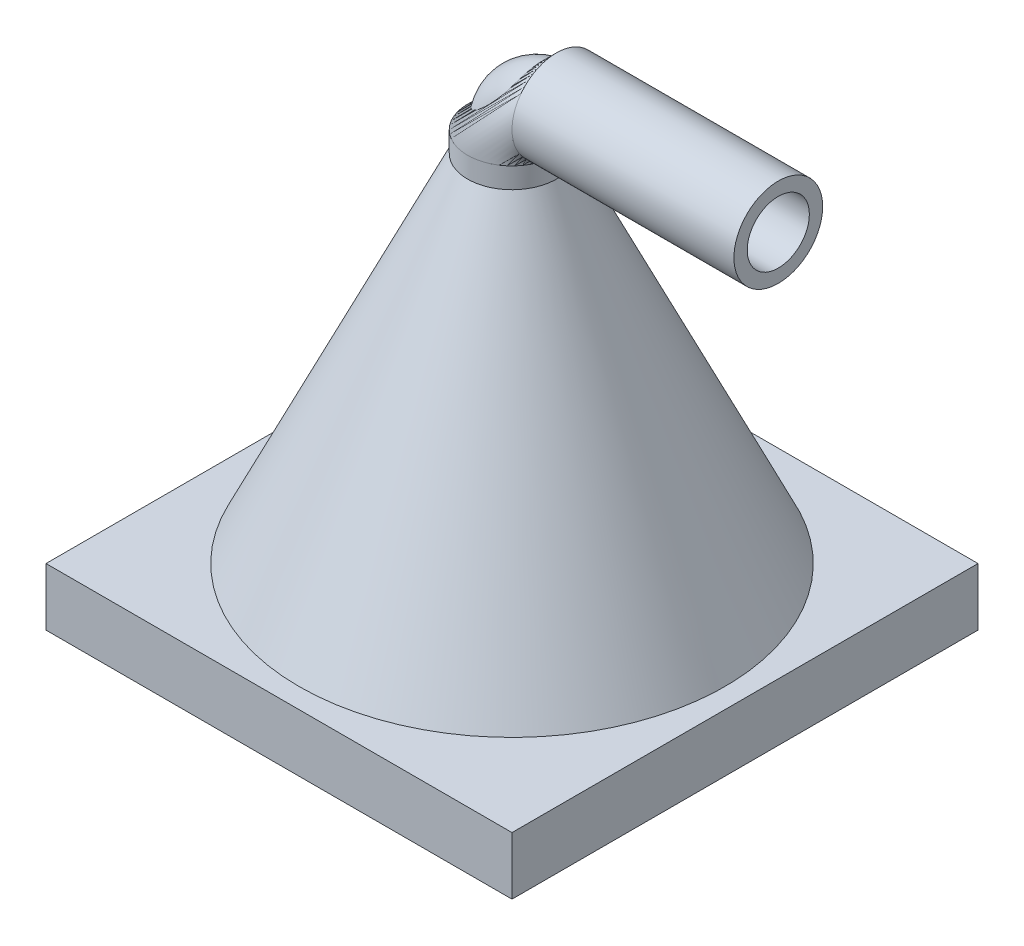
ISO-10303-21;
HEADER;
FILE_DESCRIPTION(('STEP AP214'),'2;1');
FILE_NAME('part.step','',(''),(''),'','','');
FILE_SCHEMA(('AUTOMOTIVE_DESIGN { 1 0 10303 214 1 1 1 1 }'));
ENDSEC;
DATA;
#1=APPLICATION_CONTEXT('core data for automotive mechanical design processes');
#2=APPLICATION_PROTOCOL_DEFINITION('international standard','automotive_design',2000,#1);
#3=PRODUCT_CONTEXT('',#1,'mechanical');
#4=PRODUCT('Part','Part','',(#3));
#5=PRODUCT_RELATED_PRODUCT_CATEGORY('part','',(#4));
#6=PRODUCT_DEFINITION_FORMATION('','',#4);
#7=PRODUCT_DEFINITION_CONTEXT('part definition',#1,'design');
#8=PRODUCT_DEFINITION('design','',#6,#7);
#9=PRODUCT_DEFINITION_SHAPE('','',#8);
#10=(LENGTH_UNIT() NAMED_UNIT(*) SI_UNIT(.MILLI.,.METRE.));
#11=(NAMED_UNIT(*) PLANE_ANGLE_UNIT() SI_UNIT($,.RADIAN.));
#12=(NAMED_UNIT(*) SI_UNIT($,.STERADIAN.) SOLID_ANGLE_UNIT());
#13=UNCERTAINTY_MEASURE_WITH_UNIT(LENGTH_MEASURE(1.E-05),#10,'distance_accuracy_value','');
#14=(GEOMETRIC_REPRESENTATION_CONTEXT(3) GLOBAL_UNCERTAINTY_ASSIGNED_CONTEXT((#13)) GLOBAL_UNIT_ASSIGNED_CONTEXT((#10,
#11,#12)) REPRESENTATION_CONTEXT('',''));
#15=CARTESIAN_POINT('',(0.,0.,0.));
#16=DIRECTION('',(0.,0.,1.));
#17=DIRECTION('',(1.,0.,0.));
#18=AXIS2_PLACEMENT_3D('',#15,#16,#17);
#19=CARTESIAN_POINT('',(0.,80.,0.));
#20=DIRECTION('',(0.,-1.,0.));
#21=DIRECTION('',(0.,0.,-1.));
#22=AXIS2_PLACEMENT_3D('',#19,#20,#21);
#23=CONICAL_SURFACE('',#22,10.,0.443448336419738);
#24=CARTESIAN_POINT('',(0.,0.,0.));
#25=DIRECTION('',(0.,1.,0.));
#26=DIRECTION('',(0.,0.,1.));
#27=AXIS2_PLACEMENT_3D('',#24,#25,#26);
#28=CIRCLE('',#27,48.);
#29=CARTESIAN_POINT('',(0.,0.,-48.));
#30=VERTEX_POINT('',#29);
#31=EDGE_CURVE('E47',#30,#30,#28,.T.);
#32=CARTESIAN_POINT('',(0.,80.,0.));
#33=DIRECTION('',(0.,1.,0.));
#34=DIRECTION('',(0.,0.,1.));
#35=AXIS2_PLACEMENT_3D('',#32,#33,#34);
#36=CIRCLE('',#35,10.);
#37=CARTESIAN_POINT('',(0.,80.,-10.));
#38=VERTEX_POINT('',#37);
#39=EDGE_CURVE('E12',#38,#38,#36,.T.);
#40=CARTESIAN_POINT('',(0.,0.,-48.));
#41=CARTESIAN_POINT('',(0.,0.83333333333332,-47.6041666666667));
#42=CARTESIAN_POINT('',(0.,1.66666666666665,-47.2083333333333));
#43=CARTESIAN_POINT('',(0.,3.33333333333332,-46.4166666666667));
#44=CARTESIAN_POINT('',(0.,4.16666666666666,-46.0208333333333));
#45=CARTESIAN_POINT('',(0.,5.83333333333333,-45.2291666666667));
#46=CARTESIAN_POINT('',(0.,6.66666666666666,-44.8333333333333));
#47=CARTESIAN_POINT('',(0.,8.33333333333333,-44.0416666666667));
#48=CARTESIAN_POINT('',(0.,9.16666666666666,-43.6458333333333));
#49=CARTESIAN_POINT('',(0.,10.8333333333333,-42.8541666666667));
#50=CARTESIAN_POINT('',(0.,11.6666666666667,-42.4583333333333));
#51=CARTESIAN_POINT('',(0.,13.3333333333333,-41.6666666666667));
#52=CARTESIAN_POINT('',(0.,14.1666666666667,-41.2708333333333));
#53=CARTESIAN_POINT('',(0.,15.8333333333333,-40.4791666666667));
#54=CARTESIAN_POINT('',(0.,16.6666666666667,-40.0833333333333));
#55=CARTESIAN_POINT('',(0.,18.3333333333333,-39.2916666666667));
#56=CARTESIAN_POINT('',(0.,19.1666666666667,-38.8958333333333));
#57=CARTESIAN_POINT('',(0.,20.8333333333333,-38.1041666666667));
#58=CARTESIAN_POINT('',(0.,21.6666666666667,-37.7083333333333));
#59=CARTESIAN_POINT('',(0.,23.3333333333333,-36.9166666666667));
#60=CARTESIAN_POINT('',(0.,24.1666666666667,-36.5208333333333));
#61=CARTESIAN_POINT('',(0.,25.8333333333333,-35.7291666666667));
#62=CARTESIAN_POINT('',(0.,26.6666666666667,-35.3333333333333));
#63=CARTESIAN_POINT('',(0.,28.3333333333333,-34.5416666666667));
#64=CARTESIAN_POINT('',(0.,29.1666666666667,-34.1458333333333));
#65=CARTESIAN_POINT('',(0.,30.8333333333333,-33.3541666666667));
#66=CARTESIAN_POINT('',(0.,31.6666666666667,-32.9583333333333));
#67=CARTESIAN_POINT('',(0.,33.3333333333333,-32.1666666666667));
#68=CARTESIAN_POINT('',(0.,34.1666666666667,-31.7708333333333));
#69=CARTESIAN_POINT('',(0.,35.8333333333333,-30.9791666666667));
#70=CARTESIAN_POINT('',(0.,36.6666666666667,-30.5833333333333));
#71=CARTESIAN_POINT('',(0.,38.3333333333333,-29.7916666666667));
#72=CARTESIAN_POINT('',(0.,39.1666666666667,-29.3958333333333));
#73=CARTESIAN_POINT('',(0.,40.8333333333333,-28.6041666666667));
#74=CARTESIAN_POINT('',(0.,41.6666666666667,-28.2083333333333));
#75=CARTESIAN_POINT('',(0.,43.3333333333333,-27.4166666666667));
#76=CARTESIAN_POINT('',(0.,44.1666666666667,-27.0208333333333));
#77=CARTESIAN_POINT('',(0.,45.8333333333333,-26.2291666666667));
#78=CARTESIAN_POINT('',(0.,46.6666666666667,-25.8333333333333));
#79=CARTESIAN_POINT('',(0.,48.3333333333333,-25.0416666666667));
#80=CARTESIAN_POINT('',(0.,49.1666666666667,-24.6458333333333));
#81=CARTESIAN_POINT('',(0.,50.8333333333333,-23.8541666666667));
#82=CARTESIAN_POINT('',(0.,51.6666666666667,-23.4583333333333));
#83=CARTESIAN_POINT('',(0.,53.3333333333333,-22.6666666666667));
#84=CARTESIAN_POINT('',(0.,54.1666666666667,-22.2708333333333));
#85=CARTESIAN_POINT('',(0.,55.8333333333333,-21.4791666666667));
#86=CARTESIAN_POINT('',(0.,56.6666666666667,-21.0833333333333));
#87=CARTESIAN_POINT('',(0.,58.3333333333333,-20.2916666666667));
#88=CARTESIAN_POINT('',(0.,59.1666666666667,-19.8958333333333));
#89=CARTESIAN_POINT('',(0.,60.8333333333333,-19.1041666666667));
#90=CARTESIAN_POINT('',(0.,61.6666666666667,-18.7083333333333));
#91=CARTESIAN_POINT('',(0.,63.3333333333333,-17.9166666666667));
#92=CARTESIAN_POINT('',(0.,64.1666666666667,-17.5208333333333));
#93=CARTESIAN_POINT('',(0.,65.8333333333333,-16.7291666666667));
#94=CARTESIAN_POINT('',(0.,66.6666666666667,-16.3333333333333));
#95=CARTESIAN_POINT('',(0.,68.3333333333333,-15.5416666666667));
#96=CARTESIAN_POINT('',(0.,69.1666666666667,-15.1458333333333));
#97=CARTESIAN_POINT('',(0.,70.8333333333333,-14.3541666666667));
#98=CARTESIAN_POINT('',(0.,71.6666666666667,-13.9583333333333));
#99=CARTESIAN_POINT('',(0.,73.3333333333333,-13.1666666666667));
#100=CARTESIAN_POINT('',(0.,74.1666666666667,-12.7708333333333));
#101=CARTESIAN_POINT('',(0.,75.8333333333333,-11.9791666666667));
#102=CARTESIAN_POINT('',(0.,76.6666666666667,-11.5833333333333));
#103=CARTESIAN_POINT('',(0.,78.3333333333333,-10.7916666666667));
#104=CARTESIAN_POINT('',(0.,79.1666666666667,-10.3958333333333));
#105=CARTESIAN_POINT('',(0.,80.,-10.));
#106=B_SPLINE_CURVE_WITH_KNOTS('',3,(#40,#41,#42,#43,#44,#45,#46,#47,#48,#49,#50,#51,#52,#53,
#54,#55,#56,#57,#58,#59,#60,#61,#62,#63,#64,#65,#66,#67,#68,#69,#70,#71,#72,#73,#74,#75,#76,#77,
#78,#79,#80,#81,#82,#83,#84,#85,#86,#87,#88,#89,#90,#91,#92,#93,#94,#95,#96,#97,#98,#99,#100,
#101,#102,#103,#104,#105),.UNSPECIFIED.,.F.,.F.,(4,2,2,2,2,2,2,2,2,2,2,2,2,2,2,2,2,2,2,2,2,2,2,
2,2,2,2,2,2,2,2,2,4),(0.,2.76769872818557,5.53539745637114,8.30309618455671,11.0707949127423,
13.8384936409278,16.6061923691134,19.373891097299,22.1415898254845,24.9092885536701,
27.6769872818557,30.4446860100412,33.2123847382268,35.9800834664124,38.7477821945979,
41.5154809227835,44.2831796509691,47.0508783791546,49.8185771073402,52.5862758355258,
55.3539745637113,58.1216732918969,60.8893720200824,63.657070748268,66.4247694764536,
69.1924682046391,71.9601669328247,74.7278656610103,77.4955643891958,80.2632631173814,
83.030961845567,85.7986605737525,88.5663593019381),.UNSPECIFIED.);
#107=EDGE_CURVE('BSEAM43',#30,#38,#106,.T.);
#108=ORIENTED_EDGE('',*,*,#31,.T.);
#109=ORIENTED_EDGE('',*,*,#39,.F.);
#110=ORIENTED_EDGE('',*,*,#107,.T.);
#111=ORIENTED_EDGE('',*,*,#107,.F.);
#112=EDGE_LOOP('',(#108,#110,#109,#111));
#113=FACE_BOUND('',#112,.T.);
#114=ADVANCED_FACE('F43',(#113),#23,.T.);
#115=CARTESIAN_POINT('',(60.,94.6489487770903,0.));
#116=DIRECTION('',(1.,0.,0.));
#117=DIRECTION('',(0.,0.,-1.));
#118=AXIS2_PLACEMENT_3D('',#115,#116,#117);
#119=PLANE('',#118);
#120=CARTESIAN_POINT('',(60.,94.6489487770903,0.));
#121=DIRECTION('',(1.,0.,0.));
#122=DIRECTION('',(0.,0.,-1.));
#123=AXIS2_PLACEMENT_3D('',#120,#121,#122);
#124=CIRCLE('',#123,7.);
#125=CARTESIAN_POINT('',(60.,94.6489487770903,-7.));
#126=VERTEX_POINT('',#125);
#127=EDGE_CURVE('E192',#126,#126,#124,.T.);
#128=ORIENTED_EDGE('',*,*,#127,.F.);
#129=EDGE_LOOP('',(#128));
#130=FACE_BOUND('',#129,.T.);
#131=CARTESIAN_POINT('',(60.,94.6489487770903,0.));
#132=DIRECTION('',(1.,0.,0.));
#133=DIRECTION('',(0.,0.,-1.));
#134=AXIS2_PLACEMENT_3D('',#131,#132,#133);
#135=CIRCLE('',#134,10.);
#136=CARTESIAN_POINT('',(60.,94.6489487770903,-10.));
#137=VERTEX_POINT('',#136);
#138=EDGE_CURVE('E292',#137,#137,#135,.T.);
#139=ORIENTED_EDGE('',*,*,#138,.T.);
#140=EDGE_LOOP('',(#139));
#141=FACE_BOUND('',#140,.T.);
#142=ADVANCED_FACE('F231',(#130,#141),#119,.T.);
#143=CARTESIAN_POINT('',(60.,94.6489487770903,0.));
#144=DIRECTION('',(-1.,0.,0.));
#145=DIRECTION('',(0.,0.,1.));
#146=AXIS2_PLACEMENT_3D('',#143,#144,#145);
#147=CYLINDRICAL_SURFACE('',#146,10.);
#148=CARTESIAN_POINT('',(10.0000000000001,94.6489487770903,0.));
#149=DIRECTION('',(1.,0.,0.));
#150=DIRECTION('',(0.,0.,-1.));
#151=AXIS2_PLACEMENT_3D('',#148,#149,#150);
#152=CIRCLE('',#151,10.);
#153=CARTESIAN_POINT('',(10.,84.6489487770903,0.));
#154=VERTEX_POINT('',#153);
#155=EDGE_CURVE('E289',#154,#154,#152,.T.);
#156=ORIENTED_EDGE('',*,*,#155,.T.);
#157=EDGE_LOOP('',(#156));
#158=FACE_BOUND('',#157,.T.);
#159=ORIENTED_EDGE('',*,*,#138,.F.);
#160=EDGE_LOOP('',(#159));
#161=FACE_BOUND('',#160,.T.);
#162=ADVANCED_FACE('F242',(#158,#161),#147,.T.);
#163=CARTESIAN_POINT('',(10.,84.6489487770903,0.));
#164=DIRECTION('',(0.,0.,1.));
#165=DIRECTION('',(1.,0.,0.));
#166=AXIS2_PLACEMENT_3D('',#163,#164,#165);
#167=TOROIDAL_SURFACE('',#166,10.0000000000004,10.);
#168=CARTESIAN_POINT('',(0.,84.6489487770902,0.));
#169=DIRECTION('',(0.,1.,0.));
#170=DIRECTION('',(0.,0.,-1.));
#171=AXIS2_PLACEMENT_3D('',#168,#169,#170);
#172=CIRCLE('',#171,10.);
#173=EDGE_CURVE('E53',#154,#154,#172,.T.);
#174=ORIENTED_EDGE('',*,*,#173,.T.);
#175=ORIENTED_EDGE('',*,*,#155,.F.);
#176=EDGE_LOOP('',(#174,#175));
#177=FACE_BOUND('',#176,.T.);
#178=ADVANCED_FACE('F245',(#177),#167,.T.);
#179=CARTESIAN_POINT('',(0.,84.6489487770902,0.));
#180=DIRECTION('',(0.,-1.,0.));
#181=DIRECTION('',(0.,0.,-1.));
#182=AXIS2_PLACEMENT_3D('',#179,#180,#181);
#183=CYLINDRICAL_SURFACE('',#182,10.);
#184=ORIENTED_EDGE('',*,*,#39,.T.);
#185=EDGE_LOOP('',(#184));
#186=FACE_BOUND('',#185,.T.);
#187=ORIENTED_EDGE('',*,*,#173,.F.);
#188=EDGE_LOOP('',(#187));
#189=FACE_BOUND('',#188,.T.);
#190=ADVANCED_FACE('F229',(#186,#189),#183,.T.);
#191=CARTESIAN_POINT('',(0.,78.7128295562951,0.));
#192=DIRECTION('',(0.,-1.,0.));
#193=DIRECTION('',(0.,0.,-1.));
#194=AXIS2_PLACEMENT_3D('',#191,#192,#193);
#195=CONICAL_SURFACE('',#194,7.29016748693713,0.443448336419738);
#196=CARTESIAN_POINT('',(0.,0.,0.));
#197=DIRECTION('',(0.,1.,0.));
#198=DIRECTION('',(0.,0.,1.));
#199=AXIS2_PLACEMENT_3D('',#196,#197,#198);
#200=CIRCLE('',#199,44.6787615261773);
#201=CARTESIAN_POINT('',(0.,0.,-44.6787615261773));
#202=VERTEX_POINT('',#201);
#203=EDGE_CURVE('E296',#202,#202,#200,.T.);
#204=CARTESIAN_POINT('',(0.,79.3237084761628,0.));
#205=DIRECTION('',(0.,-1.,0.));
#206=DIRECTION('',(0.,0.,-1.));
#207=AXIS2_PLACEMENT_3D('',#204,#205,#206);
#208=CIRCLE('',#207,7.);
#209=CARTESIAN_POINT('',(0.,79.3237084761628,-6.99999999999999));
#210=VERTEX_POINT('',#209);
#211=EDGE_CURVE('E295',#210,#210,#208,.F.);
#212=CARTESIAN_POINT('',(0.,0.,-44.6787615261773));
#213=CARTESIAN_POINT('',(0.,0.826288629960027,-44.2862744269463));
#214=CARTESIAN_POINT('',(0.,1.65257725992006,-43.8937873277153));
#215=CARTESIAN_POINT('',(0.,3.30515451984012,-43.1088131292533));
#216=CARTESIAN_POINT('',(0.,4.13144314980015,-42.7163260300223));
#217=CARTESIAN_POINT('',(0.,5.78402040972021,-41.9313518315602));
#218=CARTESIAN_POINT('',(0.,6.61030903968024,-41.5388647323292));
#219=CARTESIAN_POINT('',(0.,8.26288629960029,-40.7538905338672));
#220=CARTESIAN_POINT('',(0.,9.08917492956032,-40.3614034346362));
#221=CARTESIAN_POINT('',(0.,10.7417521894804,-39.5764292361741));
#222=CARTESIAN_POINT('',(0.,11.5680408194404,-39.1839421369431));
#223=CARTESIAN_POINT('',(0.,13.2206180793605,-38.3989679384811));
#224=CARTESIAN_POINT('',(0.,14.0469067093205,-38.0064808392501));
#225=CARTESIAN_POINT('',(0.,15.6994839692406,-37.2215066407881));
#226=CARTESIAN_POINT('',(0.,16.5257725992006,-36.829019541557));
#227=CARTESIAN_POINT('',(0.,18.1783498591206,-36.044045343095));
#228=CARTESIAN_POINT('',(0.,19.0046384890807,-35.651558243864));
#229=CARTESIAN_POINT('',(0.,20.6572157490007,-34.866584045402));
#230=CARTESIAN_POINT('',(0.,21.4835043789608,-34.474096946171));
#231=CARTESIAN_POINT('',(0.,23.1360816388808,-33.6891227477089));
#232=CARTESIAN_POINT('',(0.,23.9623702688408,-33.2966356484779));
#233=CARTESIAN_POINT('',(0.,25.6149475287609,-32.5116614500159));
#234=CARTESIAN_POINT('',(0.,26.4412361587209,-32.1191743507849));
#235=CARTESIAN_POINT('',(0.,28.093813418641,-31.3342001523228));
#236=CARTESIAN_POINT('',(0.,28.920102048601,-30.9417130530918));
#237=CARTESIAN_POINT('',(0.,30.5726793085211,-30.1567388546298));
#238=CARTESIAN_POINT('',(0.,31.3989679384811,-29.7642517553988));
#239=CARTESIAN_POINT('',(0.,33.0515451984012,-28.9792775569368));
#240=CARTESIAN_POINT('',(0.,33.8778338283612,-28.5867904577058));
#241=CARTESIAN_POINT('',(0.,35.5304110882813,-27.8018162592437));
#242=CARTESIAN_POINT('',(0.,36.3566997182413,-27.4093291600127));
#243=CARTESIAN_POINT('',(0.,38.0092769781613,-26.6243549615507));
#244=CARTESIAN_POINT('',(0.,38.8355656081214,-26.2318678623197));
#245=CARTESIAN_POINT('',(0.,40.4881428680414,-25.4468936638576));
#246=CARTESIAN_POINT('',(0.,41.3144314980015,-25.0544065646266));
#247=CARTESIAN_POINT('',(0.,42.9670087579215,-24.2694323661646));
#248=CARTESIAN_POINT('',(0.,43.7932973878815,-23.8769452669336));
#249=CARTESIAN_POINT('',(0.,45.4458746478016,-23.0919710684716));
#250=CARTESIAN_POINT('',(0.,46.2721632777616,-22.6994839692405));
#251=CARTESIAN_POINT('',(0.,47.9247405376817,-21.9145097707785));
#252=CARTESIAN_POINT('',(0.,48.7510291676417,-21.5220226715475));
#253=CARTESIAN_POINT('',(0.,50.4036064275618,-20.7370484730855));
#254=CARTESIAN_POINT('',(0.,51.2298950575218,-20.3445613738545));
#255=CARTESIAN_POINT('',(0.,52.8824723174419,-19.5595871753924));
#256=CARTESIAN_POINT('',(0.,53.7087609474019,-19.1671000761614));
#257=CARTESIAN_POINT('',(0.,55.361338207322,-18.3821258776994));
#258=CARTESIAN_POINT('',(0.,56.187626837282,-17.9896387784684));
#259=CARTESIAN_POINT('',(0.,57.840204097202,-17.2046645800064));
#260=CARTESIAN_POINT('',(0.,58.6664927271621,-16.8121774807753));
#261=CARTESIAN_POINT('',(0.,60.3190699870821,-16.0272032823133));
#262=CARTESIAN_POINT('',(0.,61.1453586170422,-15.6347161830823));
#263=CARTESIAN_POINT('',(0.,62.7979358769622,-14.8497419846203));
#264=CARTESIAN_POINT('',(0.,63.6242245069222,-14.4572548853893));
#265=CARTESIAN_POINT('',(0.,65.2768017668423,-13.6722806869272));
#266=CARTESIAN_POINT('',(0.,66.1030903968023,-13.2797935876962));
#267=CARTESIAN_POINT('',(0.,67.7556676567224,-12.4948193892342));
#268=CARTESIAN_POINT('',(0.,68.5819562866824,-12.1023322900032));
#269=CARTESIAN_POINT('',(0.,70.2345335466025,-11.3173580915411));
#270=CARTESIAN_POINT('',(0.,71.0608221765625,-10.9248709923101));
#271=CARTESIAN_POINT('',(0.,72.7133994364826,-10.1398967938481));
#272=CARTESIAN_POINT('',(0.,73.5396880664426,-9.74740969461709));
#273=CARTESIAN_POINT('',(0.,75.1922653263627,-8.96243549615506));
#274=CARTESIAN_POINT('',(0.,76.0185539563227,-8.56994839692404));
#275=CARTESIAN_POINT('',(0.,77.6711312162427,-7.78497419846202));
#276=CARTESIAN_POINT('',(0.,78.4974198462028,-7.392487099231));
#277=CARTESIAN_POINT('',(0.,79.3237084761628,-6.99999999999999));
#278=B_SPLINE_CURVE_WITH_KNOTS('',3,(#212,#213,#214,#215,#216,#217,#218,#219,#220,#221,#222,
#223,#224,#225,#226,#227,#228,#229,#230,#231,#232,#233,#234,#235,#236,#237,#238,#239,#240,#241,
#242,#243,#244,#245,#246,#247,#248,#249,#250,#251,#252,#253,#254,#255,#256,#257,#258,#259,#260,
#261,#262,#263,#264,#265,#266,#267,#268,#269,#270,#271,#272,#273,#274,#275,#276,#277),
.UNSPECIFIED.,.F.,.F.,(4,2,2,2,2,2,2,2,2,2,2,2,2,2,2,2,2,2,2,2,2,2,2,2,2,2,2,2,2,2,2,2,4),(0.,
2.74430158830548,5.48860317661097,8.23290476491644,10.9772063532219,13.7215079415274,
16.4658095298329,19.2101111181384,21.9544127064438,24.6987142947493,27.4430158830548,
30.1873174713603,32.9316190596658,35.6759206479712,38.4202222362767,41.1645238245822,
43.9088254128877,46.6531270011932,49.3974285894986,52.1417301778041,54.8860317661096,
57.6303333544151,60.3746349427206,63.118936531026,65.8632381193315,68.607539707637,
71.3518412959425,74.096142884248,76.8404444725534,79.5847460608589,82.3290476491644,
85.0733492374699,87.8176508257754),.UNSPECIFIED.);
#279=EDGE_CURVE('BSEAM226',#202,#210,#278,.T.);
#280=ORIENTED_EDGE('',*,*,#203,.F.);
#281=ORIENTED_EDGE('',*,*,#211,.T.);
#282=ORIENTED_EDGE('',*,*,#279,.T.);
#283=ORIENTED_EDGE('',*,*,#279,.F.);
#284=EDGE_LOOP('',(#280,#282,#281,#283));
#285=FACE_BOUND('',#284,.T.);
#286=ADVANCED_FACE('F226',(#285),#195,.F.);
#287=CARTESIAN_POINT('',(60.,94.6489487770903,0.));
#288=DIRECTION('',(-1.,0.,0.));
#289=DIRECTION('',(0.,0.,1.));
#290=AXIS2_PLACEMENT_3D('',#287,#288,#289);
#291=CYLINDRICAL_SURFACE('',#290,7.);
#292=CARTESIAN_POINT('',(9.99999999999999,94.6489487770903,0.));
#293=DIRECTION('',(-1.,0.,0.));
#294=DIRECTION('',(0.,0.,1.));
#295=AXIS2_PLACEMENT_3D('',#292,#293,#294);
#296=CIRCLE('',#295,7.);
#297=CARTESIAN_POINT('',(9.99999999999999,101.648948777091,0.));
#298=VERTEX_POINT('',#297);
#299=EDGE_CURVE('E300',#298,#298,#296,.F.);
#300=ORIENTED_EDGE('',*,*,#299,.F.);
#301=EDGE_LOOP('',(#300));
#302=FACE_BOUND('',#301,.T.);
#303=ORIENTED_EDGE('',*,*,#127,.T.);
#304=EDGE_LOOP('',(#303));
#305=FACE_BOUND('',#304,.T.);
#306=ADVANCED_FACE('F207',(#302,#305),#291,.F.);
#307=CARTESIAN_POINT('',(10.,84.6489487770903,0.));
#308=DIRECTION('',(0.,0.,1.));
#309=DIRECTION('',(1.,0.,0.));
#310=AXIS2_PLACEMENT_3D('',#307,#308,#309);
#311=TOROIDAL_SURFACE('',#310,10.0000000000004,7.);
#312=CARTESIAN_POINT('',(-4.40619762898109E-13,84.6489487770902,0.));
#313=DIRECTION('',(0.,1.,0.));
#314=DIRECTION('',(-1.,0.,0.));
#315=AXIS2_PLACEMENT_3D('',#312,#313,#314);
#316=CIRCLE('',#315,7.);
#317=CARTESIAN_POINT('',(-7.00000000000044,84.6489487770901,0.));
#318=VERTEX_POINT('',#317);
#319=EDGE_CURVE('E299',#318,#318,#316,.T.);
#320=CARTESIAN_POINT('',(10.,84.6489487770903,0.));
#321=DIRECTION('',(0.,0.,1.));
#322=DIRECTION('',(1.,0.,0.));
#323=AXIS2_PLACEMENT_3D('',#320,#321,#322);
#324=CIRCLE('',#323,17.0000000000004);
#325=EDGE_CURVE('',#298,#318,#324,.T.);
#326=ORIENTED_EDGE('',*,*,#299,.T.);
#327=ORIENTED_EDGE('',*,*,#319,.F.);
#328=ORIENTED_EDGE('',*,*,#325,.T.);
#329=ORIENTED_EDGE('',*,*,#325,.F.);
#330=EDGE_LOOP('',(#326,#328,#327,#329));
#331=FACE_BOUND('',#330,.T.);
#332=ADVANCED_FACE('F234',(#331),#311,.F.);
#333=CARTESIAN_POINT('',(0.,84.6489487770902,0.));
#334=DIRECTION('',(0.,-1.,0.));
#335=DIRECTION('',(0.,0.,-1.));
#336=AXIS2_PLACEMENT_3D('',#333,#334,#335);
#337=CYLINDRICAL_SURFACE('',#336,7.);
#338=ORIENTED_EDGE('',*,*,#211,.F.);
#339=EDGE_LOOP('',(#338));
#340=FACE_BOUND('',#339,.T.);
#341=ORIENTED_EDGE('',*,*,#319,.T.);
#342=EDGE_LOOP('',(#341));
#343=FACE_BOUND('',#342,.T.);
#344=ADVANCED_FACE('F205',(#340,#343),#337,.F.);
#345=CARTESIAN_POINT('',(0.,0.,0.));
#346=DIRECTION('',(0.,-1.,0.));
#347=DIRECTION('',(0.,0.,-1.));
#348=AXIS2_PLACEMENT_3D('',#345,#346,#347);
#349=PLANE('',#348);
#350=DIRECTION('',(0.,0.,1.));
#351=VECTOR('',#350,1.);
#352=CARTESIAN_POINT('',(52.5,0.,52.5));
#353=LINE('',#352,#351);
#354=CARTESIAN_POINT('',(52.5,0.,-52.5));
#355=VERTEX_POINT('',#354);
#356=CARTESIAN_POINT('',(52.5,0.,52.5));
#357=VERTEX_POINT('',#356);
#358=EDGE_CURVE('E163',#355,#357,#353,.T.);
#359=ORIENTED_EDGE('',*,*,#358,.F.);
#360=DIRECTION('',(1.,0.,0.));
#361=VECTOR('',#360,1.);
#362=CARTESIAN_POINT('',(-52.5,0.,-52.5));
#363=LINE('',#362,#361);
#364=CARTESIAN_POINT('',(-52.5,0.,-52.5));
#365=VERTEX_POINT('',#364);
#366=EDGE_CURVE('E170',#365,#355,#363,.T.);
#367=ORIENTED_EDGE('',*,*,#366,.F.);
#368=DIRECTION('',(0.,0.,-1.));
#369=VECTOR('',#368,1.);
#370=CARTESIAN_POINT('',(-52.5,0.,52.5));
#371=LINE('',#370,#369);
#372=CARTESIAN_POINT('',(-52.5,0.,52.5));
#373=VERTEX_POINT('',#372);
#374=EDGE_CURVE('E168',#373,#365,#371,.T.);
#375=ORIENTED_EDGE('',*,*,#374,.F.);
#376=DIRECTION('',(-1.,0.,0.));
#377=VECTOR('',#376,1.);
#378=CARTESIAN_POINT('',(-52.5,0.,52.5));
#379=LINE('',#378,#377);
#380=EDGE_CURVE('E166',#357,#373,#379,.T.);
#381=ORIENTED_EDGE('',*,*,#380,.F.);
#382=EDGE_LOOP('',(#359,#367,#375,#381));
#383=FACE_BOUND('',#382,.T.);
#384=ORIENTED_EDGE('',*,*,#31,.F.);
#385=EDGE_LOOP('',(#384));
#386=FACE_BOUND('',#385,.T.);
#387=ADVANCED_FACE('F194',(#383,#386),#349,.F.);
#388=CARTESIAN_POINT('',(0.,-3.,0.));
#389=DIRECTION('',(0.,-1.,0.));
#390=DIRECTION('',(0.,0.,-1.));
#391=AXIS2_PLACEMENT_3D('',#388,#389,#390);
#392=PLANE('',#391);
#393=DIRECTION('',(0.,0.,1.));
#394=VECTOR('',#393,1.);
#395=CARTESIAN_POINT('',(50.,-3.,50.));
#396=LINE('',#395,#394);
#397=CARTESIAN_POINT('',(50.,-3.,-50.));
#398=VERTEX_POINT('',#397);
#399=CARTESIAN_POINT('',(50.,-3.,50.));
#400=VERTEX_POINT('',#399);
#401=EDGE_CURVE('E60',#398,#400,#396,.T.);
#402=ORIENTED_EDGE('',*,*,#401,.T.);
#403=DIRECTION('',(-1.,0.,0.));
#404=VECTOR('',#403,1.);
#405=CARTESIAN_POINT('',(-50.,-3.,50.));
#406=LINE('',#405,#404);
#407=CARTESIAN_POINT('',(-50.,-3.,50.));
#408=VERTEX_POINT('',#407);
#409=EDGE_CURVE('E64',#400,#408,#406,.T.);
#410=ORIENTED_EDGE('',*,*,#409,.T.);
#411=DIRECTION('',(0.,0.,-1.));
#412=VECTOR('',#411,1.);
#413=CARTESIAN_POINT('',(-50.,-3.,50.));
#414=LINE('',#413,#412);
#415=CARTESIAN_POINT('',(-50.,-3.,-50.));
#416=VERTEX_POINT('',#415);
#417=EDGE_CURVE('E141',#408,#416,#414,.T.);
#418=ORIENTED_EDGE('',*,*,#417,.T.);
#419=DIRECTION('',(1.,0.,0.));
#420=VECTOR('',#419,1.);
#421=CARTESIAN_POINT('',(-50.,-3.,-50.));
#422=LINE('',#421,#420);
#423=EDGE_CURVE('E122',#416,#398,#422,.T.);
#424=ORIENTED_EDGE('',*,*,#423,.T.);
#425=EDGE_LOOP('',(#402,#410,#418,#424));
#426=FACE_BOUND('',#425,.T.);
#427=CARTESIAN_POINT('',(0.,-3.,0.));
#428=DIRECTION('',(0.,-1.,0.));
#429=DIRECTION('',(0.,0.,-1.));
#430=AXIS2_PLACEMENT_3D('',#427,#428,#429);
#431=CIRCLE('',#430,44.6787615261773);
#432=CARTESIAN_POINT('',(0.,-3.,-44.6787615261773));
#433=VERTEX_POINT('',#432);
#434=EDGE_CURVE('E160',#433,#433,#431,.T.);
#435=ORIENTED_EDGE('',*,*,#434,.F.);
#436=EDGE_LOOP('',(#435));
#437=FACE_BOUND('',#436,.T.);
#438=ADVANCED_FACE('F204',(#426,#437),#392,.T.);
#439=CARTESIAN_POINT('',(52.5,-3.,52.5));
#440=DIRECTION('',(-1.,0.,0.));
#441=DIRECTION('',(0.,0.,1.));
#442=AXIS2_PLACEMENT_3D('',#439,#440,#441);
#443=PLANE('',#442);
#444=ORIENTED_EDGE('',*,*,#358,.T.);
#445=DIRECTION('',(0.,1.,0.));
#446=VECTOR('',#445,1.);
#447=CARTESIAN_POINT('',(52.5,-3.,52.5));
#448=LINE('',#447,#446);
#449=CARTESIAN_POINT('',(52.5,-13.,52.5));
#450=VERTEX_POINT('',#449);
#451=EDGE_CURVE('E181',#450,#357,#448,.T.);
#452=ORIENTED_EDGE('',*,*,#451,.F.);
#453=DIRECTION('',(0.,0.,1.));
#454=VECTOR('',#453,1.);
#455=CARTESIAN_POINT('',(52.5,-13.,52.5));
#456=LINE('',#455,#454);
#457=CARTESIAN_POINT('',(52.5,-13.,-52.5));
#458=VERTEX_POINT('',#457);
#459=EDGE_CURVE('E127',#458,#450,#456,.T.);
#460=ORIENTED_EDGE('',*,*,#459,.F.);
#461=DIRECTION('',(0.,1.,0.));
#462=VECTOR('',#461,1.);
#463=CARTESIAN_POINT('',(52.5,-3.,-52.5));
#464=LINE('',#463,#462);
#465=EDGE_CURVE('E172',#458,#355,#464,.T.);
#466=ORIENTED_EDGE('',*,*,#465,.T.);
#467=EDGE_LOOP('',(#444,#452,#460,#466));
#468=FACE_BOUND('',#467,.T.);
#469=ADVANCED_FACE('F221',(#468),#443,.F.);
#470=CARTESIAN_POINT('',(-52.5,-3.,52.5));
#471=DIRECTION('',(0.,0.,-1.));
#472=DIRECTION('',(-1.,0.,0.));
#473=AXIS2_PLACEMENT_3D('',#470,#471,#472);
#474=PLANE('',#473);
#475=ORIENTED_EDGE('',*,*,#380,.T.);
#476=DIRECTION('',(0.,1.,0.));
#477=VECTOR('',#476,1.);
#478=CARTESIAN_POINT('',(-52.5,-3.,52.5));
#479=LINE('',#478,#477);
#480=CARTESIAN_POINT('',(-52.5,-13.,52.5));
#481=VERTEX_POINT('',#480);
#482=EDGE_CURVE('E178',#481,#373,#479,.T.);
#483=ORIENTED_EDGE('',*,*,#482,.F.);
#484=DIRECTION('',(-1.,0.,0.));
#485=VECTOR('',#484,1.);
#486=CARTESIAN_POINT('',(-52.5,-13.,52.5));
#487=LINE('',#486,#485);
#488=EDGE_CURVE('E151',#450,#481,#487,.T.);
#489=ORIENTED_EDGE('',*,*,#488,.F.);
#490=ORIENTED_EDGE('',*,*,#451,.T.);
#491=EDGE_LOOP('',(#475,#483,#489,#490));
#492=FACE_BOUND('',#491,.T.);
#493=ADVANCED_FACE('F217',(#492),#474,.F.);
#494=CARTESIAN_POINT('',(-52.5,-3.,52.5));
#495=DIRECTION('',(1.,0.,0.));
#496=DIRECTION('',(0.,0.,-1.));
#497=AXIS2_PLACEMENT_3D('',#494,#495,#496);
#498=PLANE('',#497);
#499=ORIENTED_EDGE('',*,*,#374,.T.);
#500=DIRECTION('',(0.,1.,0.));
#501=VECTOR('',#500,1.);
#502=CARTESIAN_POINT('',(-52.5,-3.,-52.5));
#503=LINE('',#502,#501);
#504=CARTESIAN_POINT('',(-52.5,-13.,-52.5));
#505=VERTEX_POINT('',#504);
#506=EDGE_CURVE('E175',#505,#365,#503,.T.);
#507=ORIENTED_EDGE('',*,*,#506,.F.);
#508=DIRECTION('',(0.,0.,-1.));
#509=VECTOR('',#508,1.);
#510=CARTESIAN_POINT('',(-52.5,-13.,52.5));
#511=LINE('',#510,#509);
#512=EDGE_CURVE('E154',#481,#505,#511,.T.);
#513=ORIENTED_EDGE('',*,*,#512,.F.);
#514=ORIENTED_EDGE('',*,*,#482,.T.);
#515=EDGE_LOOP('',(#499,#507,#513,#514));
#516=FACE_BOUND('',#515,.T.);
#517=ADVANCED_FACE('F213',(#516),#498,.F.);
#518=CARTESIAN_POINT('',(-52.5,-3.,-52.5));
#519=DIRECTION('',(0.,0.,1.));
#520=DIRECTION('',(1.,0.,0.));
#521=AXIS2_PLACEMENT_3D('',#518,#519,#520);
#522=PLANE('',#521);
#523=ORIENTED_EDGE('',*,*,#366,.T.);
#524=ORIENTED_EDGE('',*,*,#465,.F.);
#525=DIRECTION('',(1.,0.,0.));
#526=VECTOR('',#525,1.);
#527=CARTESIAN_POINT('',(-52.5,-13.,-52.5));
#528=LINE('',#527,#526);
#529=EDGE_CURVE('E157',#505,#458,#528,.T.);
#530=ORIENTED_EDGE('',*,*,#529,.F.);
#531=ORIENTED_EDGE('',*,*,#506,.T.);
#532=EDGE_LOOP('',(#523,#524,#530,#531));
#533=FACE_BOUND('',#532,.T.);
#534=ADVANCED_FACE('F209',(#533),#522,.F.);
#535=CARTESIAN_POINT('',(0.,-3.,0.));
#536=DIRECTION('',(0.,1.,0.));
#537=DIRECTION('',(0.,0.,1.));
#538=AXIS2_PLACEMENT_3D('',#535,#536,#537);
#539=CYLINDRICAL_SURFACE('',#538,44.6787615261773);
#540=ORIENTED_EDGE('',*,*,#434,.T.);
#541=EDGE_LOOP('',(#540));
#542=FACE_BOUND('',#541,.T.);
#543=ORIENTED_EDGE('',*,*,#203,.T.);
#544=EDGE_LOOP('',(#543));
#545=FACE_BOUND('',#544,.T.);
#546=ADVANCED_FACE('F212',(#542,#545),#539,.F.);
#547=CARTESIAN_POINT('',(0.,-13.,0.));
#548=DIRECTION('',(0.,-1.,0.));
#549=DIRECTION('',(0.,0.,-1.));
#550=AXIS2_PLACEMENT_3D('',#547,#548,#549);
#551=PLANE('',#550);
#552=ORIENTED_EDGE('',*,*,#459,.T.);
#553=ORIENTED_EDGE('',*,*,#488,.T.);
#554=ORIENTED_EDGE('',*,*,#512,.T.);
#555=ORIENTED_EDGE('',*,*,#529,.T.);
#556=EDGE_LOOP('',(#552,#553,#554,#555));
#557=FACE_BOUND('',#556,.T.);
#558=DIRECTION('',(-1.,0.,0.));
#559=VECTOR('',#558,1.);
#560=CARTESIAN_POINT('',(-50.,-13.,50.));
#561=LINE('',#560,#559);
#562=CARTESIAN_POINT('',(50.,-13.,50.));
#563=VERTEX_POINT('',#562);
#564=CARTESIAN_POINT('',(-50.,-13.,50.));
#565=VERTEX_POINT('',#564);
#566=EDGE_CURVE('E121',#563,#565,#561,.T.);
#567=ORIENTED_EDGE('',*,*,#566,.F.);
#568=DIRECTION('',(0.,0.,1.));
#569=VECTOR('',#568,1.);
#570=CARTESIAN_POINT('',(50.,-13.,50.));
#571=LINE('',#570,#569);
#572=CARTESIAN_POINT('',(50.,-13.,-50.));
#573=VERTEX_POINT('',#572);
#574=EDGE_CURVE('E112',#573,#563,#571,.T.);
#575=ORIENTED_EDGE('',*,*,#574,.F.);
#576=DIRECTION('',(1.,0.,0.));
#577=VECTOR('',#576,1.);
#578=CARTESIAN_POINT('',(-50.,-13.,-50.));
#579=LINE('',#578,#577);
#580=CARTESIAN_POINT('',(-50.,-13.,-50.));
#581=VERTEX_POINT('',#580);
#582=EDGE_CURVE('E135',#581,#573,#579,.T.);
#583=ORIENTED_EDGE('',*,*,#582,.F.);
#584=DIRECTION('',(0.,0.,-1.));
#585=VECTOR('',#584,1.);
#586=CARTESIAN_POINT('',(-50.,-13.,50.));
#587=LINE('',#586,#585);
#588=EDGE_CURVE('E133',#565,#581,#587,.T.);
#589=ORIENTED_EDGE('',*,*,#588,.F.);
#590=EDGE_LOOP('',(#567,#575,#583,#589));
#591=FACE_BOUND('',#590,.T.);
#592=ADVANCED_FACE('F131',(#557,#591),#551,.T.);
#593=CARTESIAN_POINT('',(50.,-13.,50.));
#594=DIRECTION('',(-1.,0.,0.));
#595=DIRECTION('',(0.,0.,1.));
#596=AXIS2_PLACEMENT_3D('',#593,#594,#595);
#597=PLANE('',#596);
#598=ORIENTED_EDGE('',*,*,#401,.F.);
#599=DIRECTION('',(0.,1.,0.));
#600=VECTOR('',#599,1.);
#601=CARTESIAN_POINT('',(50.,-13.,-50.));
#602=LINE('',#601,#600);
#603=EDGE_CURVE('E117',#573,#398,#602,.T.);
#604=ORIENTED_EDGE('',*,*,#603,.F.);
#605=ORIENTED_EDGE('',*,*,#574,.T.);
#606=DIRECTION('',(0.,1.,0.));
#607=VECTOR('',#606,1.);
#608=CARTESIAN_POINT('',(50.,-13.,50.));
#609=LINE('',#608,#607);
#610=EDGE_CURVE('E115',#563,#400,#609,.T.);
#611=ORIENTED_EDGE('',*,*,#610,.T.);
#612=EDGE_LOOP('',(#598,#604,#605,#611));
#613=FACE_BOUND('',#612,.T.);
#614=ADVANCED_FACE('F114',(#613),#597,.T.);
#615=CARTESIAN_POINT('',(-50.,-13.,50.));
#616=DIRECTION('',(0.,0.,-1.));
#617=DIRECTION('',(-1.,0.,0.));
#618=AXIS2_PLACEMENT_3D('',#615,#616,#617);
#619=PLANE('',#618);
#620=ORIENTED_EDGE('',*,*,#409,.F.);
#621=ORIENTED_EDGE('',*,*,#610,.F.);
#622=ORIENTED_EDGE('',*,*,#566,.T.);
#623=DIRECTION('',(0.,1.,0.));
#624=VECTOR('',#623,1.);
#625=CARTESIAN_POINT('',(-50.,-13.,50.));
#626=LINE('',#625,#624);
#627=EDGE_CURVE('E128',#565,#408,#626,.T.);
#628=ORIENTED_EDGE('',*,*,#627,.T.);
#629=EDGE_LOOP('',(#620,#621,#622,#628));
#630=FACE_BOUND('',#629,.T.);
#631=ADVANCED_FACE('F125',(#630),#619,.T.);
#632=CARTESIAN_POINT('',(-50.,-13.,50.));
#633=DIRECTION('',(1.,0.,0.));
#634=DIRECTION('',(0.,0.,-1.));
#635=AXIS2_PLACEMENT_3D('',#632,#633,#634);
#636=PLANE('',#635);
#637=ORIENTED_EDGE('',*,*,#417,.F.);
#638=ORIENTED_EDGE('',*,*,#627,.F.);
#639=ORIENTED_EDGE('',*,*,#588,.T.);
#640=DIRECTION('',(0.,1.,0.));
#641=VECTOR('',#640,1.);
#642=CARTESIAN_POINT('',(-50.,-13.,-50.));
#643=LINE('',#642,#641);
#644=EDGE_CURVE('E145',#581,#416,#643,.T.);
#645=ORIENTED_EDGE('',*,*,#644,.T.);
#646=EDGE_LOOP('',(#637,#638,#639,#645));
#647=FACE_BOUND('',#646,.T.);
#648=ADVANCED_FACE('F411',(#647),#636,.T.);
#649=CARTESIAN_POINT('',(-50.,-13.,-50.));
#650=DIRECTION('',(0.,0.,1.));
#651=DIRECTION('',(1.,0.,0.));
#652=AXIS2_PLACEMENT_3D('',#649,#650,#651);
#653=PLANE('',#652);
#654=ORIENTED_EDGE('',*,*,#423,.F.);
#655=ORIENTED_EDGE('',*,*,#644,.F.);
#656=ORIENTED_EDGE('',*,*,#582,.T.);
#657=ORIENTED_EDGE('',*,*,#603,.T.);
#658=EDGE_LOOP('',(#654,#655,#656,#657));
#659=FACE_BOUND('',#658,.T.);
#660=ADVANCED_FACE('F421',(#659),#653,.T.);
#661=CLOSED_SHELL('',(#114,#142,#162,#178,#190,#286,#306,#332,#344,#387,#438,#469,#493,#517,
#534,#546,#592,#614,#631,#648,#660));
#662=MANIFOLD_SOLID_BREP('B2',#661);
#663=ADVANCED_BREP_SHAPE_REPRESENTATION('',(#18,#662),#14);
#664=SHAPE_DEFINITION_REPRESENTATION(#9,#663);
ENDSEC;
END-ISO-10303-21;
